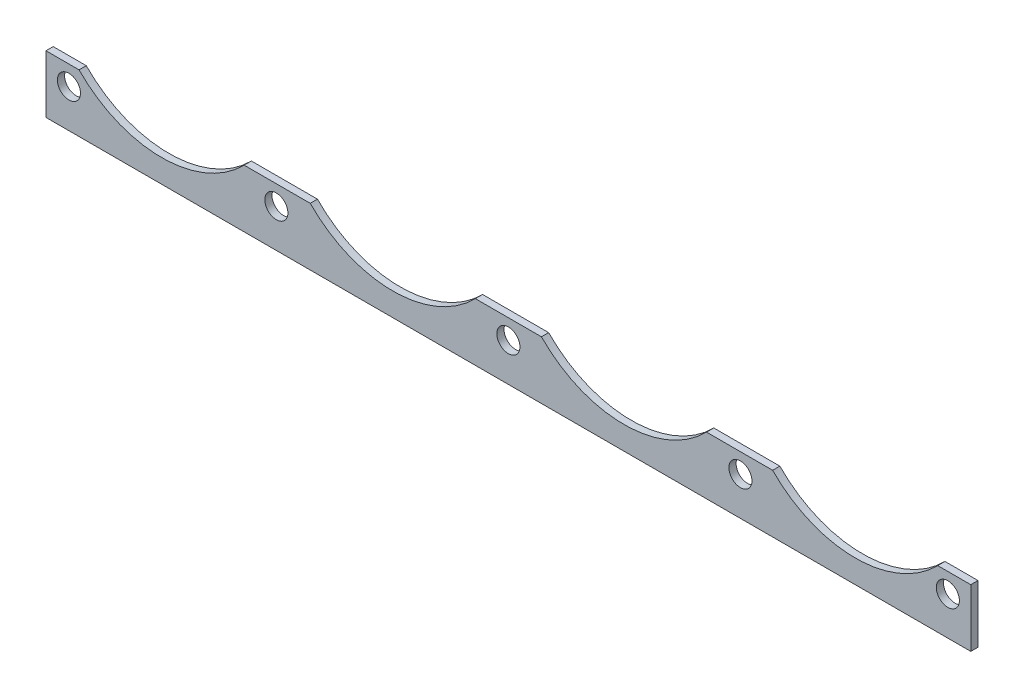
ISO-10303-21;
HEADER;
FILE_DESCRIPTION(('STEP AP214'),'2;1');
FILE_NAME('part.step','',(''),(''),'','','');
FILE_SCHEMA(('AUTOMOTIVE_DESIGN { 1 0 10303 214 1 1 1 1 }'));
ENDSEC;
DATA;
#1=APPLICATION_CONTEXT('core data for automotive mechanical design processes');
#2=APPLICATION_PROTOCOL_DEFINITION('international standard','automotive_design',2000,#1);
#3=PRODUCT_CONTEXT('',#1,'mechanical');
#4=PRODUCT('Part','Part','',(#3));
#5=PRODUCT_RELATED_PRODUCT_CATEGORY('part','',(#4));
#6=PRODUCT_DEFINITION_FORMATION('','',#4);
#7=PRODUCT_DEFINITION_CONTEXT('part definition',#1,'design');
#8=PRODUCT_DEFINITION('design','',#6,#7);
#9=PRODUCT_DEFINITION_SHAPE('','',#8);
#10=(LENGTH_UNIT() NAMED_UNIT(*) SI_UNIT(.MILLI.,.METRE.));
#11=(NAMED_UNIT(*) PLANE_ANGLE_UNIT() SI_UNIT($,.RADIAN.));
#12=(NAMED_UNIT(*) SI_UNIT($,.STERADIAN.) SOLID_ANGLE_UNIT());
#13=UNCERTAINTY_MEASURE_WITH_UNIT(LENGTH_MEASURE(1.E-05),#10,'distance_accuracy_value','');
#14=(GEOMETRIC_REPRESENTATION_CONTEXT(3) GLOBAL_UNCERTAINTY_ASSIGNED_CONTEXT((#13)) GLOBAL_UNIT_ASSIGNED_CONTEXT((#10,
#11,#12)) REPRESENTATION_CONTEXT('',''));
#15=CARTESIAN_POINT('',(0.,0.,0.));
#16=DIRECTION('',(0.,0.,1.));
#17=DIRECTION('',(1.,0.,0.));
#18=AXIS2_PLACEMENT_3D('',#15,#16,#17);
#19=CARTESIAN_POINT('',(25.4,30.48,0.79375));
#20=DIRECTION('',(0.,0.,-1.));
#21=DIRECTION('',(-1.,0.,0.));
#22=AXIS2_PLACEMENT_3D('',#19,#20,#21);
#23=CYLINDRICAL_SURFACE('',#22,25.4);
#24=CARTESIAN_POINT('',(25.4,30.48,-0.79375));
#25=DIRECTION('',(0.,0.,1.));
#26=DIRECTION('',(1.,0.,0.));
#27=AXIS2_PLACEMENT_3D('',#24,#25,#26);
#28=CIRCLE('',#27,25.4);
#29=CARTESIAN_POINT('',(7.26077179150114,12.7,-0.79375));
#30=VERTEX_POINT('',#29);
#31=CARTESIAN_POINT('',(43.5392282084988,12.7,-0.79375));
#32=VERTEX_POINT('',#31);
#33=EDGE_CURVE('E167',#30,#32,#28,.T.);
#34=ORIENTED_EDGE('',*,*,#33,.F.);
#35=DIRECTION('',(0.,0.,-1.));
#36=VECTOR('',#35,1.);
#37=CARTESIAN_POINT('',(7.26077179150114,12.7,0.79375));
#38=LINE('',#37,#36);
#39=CARTESIAN_POINT('',(7.26077179150114,12.7,0.79375));
#40=VERTEX_POINT('',#39);
#41=EDGE_CURVE('E11',#40,#30,#38,.T.);
#42=ORIENTED_EDGE('',*,*,#41,.F.);
#43=CARTESIAN_POINT('',(25.4,30.48,0.79375));
#44=DIRECTION('',(0.,0.,1.));
#45=DIRECTION('',(1.,0.,0.));
#46=AXIS2_PLACEMENT_3D('',#43,#44,#45);
#47=CIRCLE('',#46,25.4);
#48=CARTESIAN_POINT('',(43.5392282084988,12.7,0.79375));
#49=VERTEX_POINT('',#48);
#50=EDGE_CURVE('E262',#40,#49,#47,.T.);
#51=ORIENTED_EDGE('',*,*,#50,.T.);
#52=DIRECTION('',(0.,0.,-1.));
#53=VECTOR('',#52,1.);
#54=CARTESIAN_POINT('',(43.5392282084988,12.7,0.79375));
#55=LINE('',#54,#53);
#56=EDGE_CURVE('E52',#49,#32,#55,.T.);
#57=ORIENTED_EDGE('',*,*,#56,.T.);
#58=EDGE_LOOP('',(#34,#42,#51,#57));
#59=FACE_BOUND('',#58,.T.);
#60=ADVANCED_FACE('F35',(#59),#23,.F.);
#61=CARTESIAN_POINT('',(0.,12.7,0.79375));
#62=DIRECTION('',(0.,1.,0.));
#63=DIRECTION('',(-1.,0.,0.));
#64=AXIS2_PLACEMENT_3D('',#61,#62,#63);
#65=PLANE('',#64);
#66=DIRECTION('',(1.,0.,0.));
#67=VECTOR('',#66,1.);
#68=CARTESIAN_POINT('',(0.,12.7,-0.79375));
#69=LINE('',#68,#67);
#70=CARTESIAN_POINT('',(-7.26077179150115,12.7,-0.79375));
#71=VERTEX_POINT('',#70);
#72=EDGE_CURVE('E169',#71,#30,#69,.T.);
#73=ORIENTED_EDGE('',*,*,#72,.F.);
#74=DIRECTION('',(0.,0.,-1.));
#75=VECTOR('',#74,1.);
#76=CARTESIAN_POINT('',(-7.26077179150115,12.7,0.79375));
#77=LINE('',#76,#75);
#78=CARTESIAN_POINT('',(-7.26077179150115,12.7,0.79375));
#79=VERTEX_POINT('',#78);
#80=EDGE_CURVE('E44',#79,#71,#77,.T.);
#81=ORIENTED_EDGE('',*,*,#80,.F.);
#82=DIRECTION('',(1.,0.,0.));
#83=VECTOR('',#82,1.);
#84=CARTESIAN_POINT('',(0.,12.7,0.79375));
#85=LINE('',#84,#83);
#86=EDGE_CURVE('E258',#79,#40,#85,.T.);
#87=ORIENTED_EDGE('',*,*,#86,.T.);
#88=ORIENTED_EDGE('',*,*,#41,.T.);
#89=EDGE_LOOP('',(#73,#81,#87,#88));
#90=FACE_BOUND('',#89,.T.);
#91=ADVANCED_FACE('F232',(#90),#65,.T.);
#92=CARTESIAN_POINT('',(-25.4,30.48,0.79375));
#93=DIRECTION('',(0.,0.,-1.));
#94=DIRECTION('',(-1.,0.,0.));
#95=AXIS2_PLACEMENT_3D('',#92,#93,#94);
#96=CYLINDRICAL_SURFACE('',#95,25.4);
#97=CARTESIAN_POINT('',(-25.4,30.48,-0.79375));
#98=DIRECTION('',(0.,0.,1.));
#99=DIRECTION('',(1.,0.,0.));
#100=AXIS2_PLACEMENT_3D('',#97,#98,#99);
#101=CIRCLE('',#100,25.4);
#102=CARTESIAN_POINT('',(-43.5392282084988,12.7,-0.79375));
#103=VERTEX_POINT('',#102);
#104=EDGE_CURVE('E172',#103,#71,#101,.T.);
#105=ORIENTED_EDGE('',*,*,#104,.F.);
#106=DIRECTION('',(0.,0.,-1.));
#107=VECTOR('',#106,1.);
#108=CARTESIAN_POINT('',(-43.5392282084988,12.7,0.79375));
#109=LINE('',#108,#107);
#110=CARTESIAN_POINT('',(-43.5392282084988,12.7,0.79375));
#111=VERTEX_POINT('',#110);
#112=EDGE_CURVE('E220',#111,#103,#109,.T.);
#113=ORIENTED_EDGE('',*,*,#112,.F.);
#114=CARTESIAN_POINT('',(-25.4,30.48,0.79375));
#115=DIRECTION('',(0.,0.,1.));
#116=DIRECTION('',(1.,0.,0.));
#117=AXIS2_PLACEMENT_3D('',#114,#115,#116);
#118=CIRCLE('',#117,25.4);
#119=EDGE_CURVE('E228',#111,#79,#118,.T.);
#120=ORIENTED_EDGE('',*,*,#119,.T.);
#121=ORIENTED_EDGE('',*,*,#80,.T.);
#122=EDGE_LOOP('',(#105,#113,#120,#121));
#123=FACE_BOUND('',#122,.T.);
#124=ADVANCED_FACE('F225',(#123),#96,.F.);
#125=CARTESIAN_POINT('',(-58.0607717915011,12.7,-0.79375));
#126=VERTEX_POINT('',#125);
#127=EDGE_CURVE('E174',#126,#103,#69,.T.);
#128=ORIENTED_EDGE('',*,*,#127,.F.);
#129=DIRECTION('',(0.,0.,-1.));
#130=VECTOR('',#129,1.);
#131=CARTESIAN_POINT('',(-58.0607717915011,12.7,0.79375));
#132=LINE('',#131,#130);
#133=CARTESIAN_POINT('',(-58.0607717915011,12.7,0.79375));
#134=VERTEX_POINT('',#133);
#135=EDGE_CURVE('E218',#134,#126,#132,.T.);
#136=ORIENTED_EDGE('',*,*,#135,.F.);
#137=EDGE_CURVE('E256',#134,#111,#85,.T.);
#138=ORIENTED_EDGE('',*,*,#137,.T.);
#139=ORIENTED_EDGE('',*,*,#112,.T.);
#140=EDGE_LOOP('',(#128,#136,#138,#139));
#141=FACE_BOUND('',#140,.T.);
#142=ADVANCED_FACE('F255',(#141),#65,.T.);
#143=CARTESIAN_POINT('',(-76.2,30.48,0.79375));
#144=DIRECTION('',(0.,0.,-1.));
#145=DIRECTION('',(-1.,0.,0.));
#146=AXIS2_PLACEMENT_3D('',#143,#144,#145);
#147=CYLINDRICAL_SURFACE('',#146,25.4);
#148=CARTESIAN_POINT('',(-76.2,30.48,-0.79375));
#149=DIRECTION('',(0.,0.,1.));
#150=DIRECTION('',(1.,0.,0.));
#151=AXIS2_PLACEMENT_3D('',#148,#149,#150);
#152=CIRCLE('',#151,25.4);
#153=CARTESIAN_POINT('',(-94.3392282084988,12.7,-0.79375));
#154=VERTEX_POINT('',#153);
#155=EDGE_CURVE('E177',#154,#126,#152,.T.);
#156=ORIENTED_EDGE('',*,*,#155,.F.);
#157=DIRECTION('',(0.,0.,-1.));
#158=VECTOR('',#157,1.);
#159=CARTESIAN_POINT('',(-94.3392282084988,12.7,0.79375));
#160=LINE('',#159,#158);
#161=CARTESIAN_POINT('',(-94.3392282084988,12.7,0.79375));
#162=VERTEX_POINT('',#161);
#163=EDGE_CURVE('E216',#162,#154,#160,.T.);
#164=ORIENTED_EDGE('',*,*,#163,.F.);
#165=CARTESIAN_POINT('',(-76.2,30.48,0.79375));
#166=DIRECTION('',(0.,0.,1.));
#167=DIRECTION('',(1.,0.,0.));
#168=AXIS2_PLACEMENT_3D('',#165,#166,#167);
#169=CIRCLE('',#168,25.4);
#170=EDGE_CURVE('E252',#162,#134,#169,.T.);
#171=ORIENTED_EDGE('',*,*,#170,.T.);
#172=ORIENTED_EDGE('',*,*,#135,.T.);
#173=EDGE_LOOP('',(#156,#164,#171,#172));
#174=FACE_BOUND('',#173,.T.);
#175=ADVANCED_FACE('F251',(#174),#147,.F.);
#176=CARTESIAN_POINT('',(-101.6,12.7,-0.79375));
#177=VERTEX_POINT('',#176);
#178=EDGE_CURVE('E173',#177,#154,#69,.T.);
#179=ORIENTED_EDGE('',*,*,#178,.F.);
#180=DIRECTION('',(0.,0.,-1.));
#181=VECTOR('',#180,1.);
#182=CARTESIAN_POINT('',(-101.6,12.7,0.79375));
#183=LINE('',#182,#181);
#184=CARTESIAN_POINT('',(-101.6,12.7,0.79375));
#185=VERTEX_POINT('',#184);
#186=EDGE_CURVE('E214',#185,#177,#183,.T.);
#187=ORIENTED_EDGE('',*,*,#186,.F.);
#188=EDGE_CURVE('E247',#185,#162,#85,.T.);
#189=ORIENTED_EDGE('',*,*,#188,.T.);
#190=ORIENTED_EDGE('',*,*,#163,.T.);
#191=EDGE_LOOP('',(#179,#187,#189,#190));
#192=FACE_BOUND('',#191,.T.);
#193=ADVANCED_FACE('F243',(#192),#65,.T.);
#194=CARTESIAN_POINT('',(-101.6,1.11022302462516E-13,0.79375));
#195=DIRECTION('',(1.,0.,0.));
#196=DIRECTION('',(0.,1.,0.));
#197=AXIS2_PLACEMENT_3D('',#194,#195,#196);
#198=PLANE('',#197);
#199=DIRECTION('',(0.,-1.,0.));
#200=VECTOR('',#199,1.);
#201=CARTESIAN_POINT('',(-101.6,1.11022302462516E-13,-0.79375));
#202=LINE('',#201,#200);
#203=CARTESIAN_POINT('',(-101.6,0.,-0.79375));
#204=VERTEX_POINT('',#203);
#205=EDGE_CURVE('E180',#177,#204,#202,.T.);
#206=ORIENTED_EDGE('',*,*,#205,.T.);
#207=DIRECTION('',(0.,0.,-1.));
#208=VECTOR('',#207,1.);
#209=CARTESIAN_POINT('',(-101.6,0.,0.79375));
#210=LINE('',#209,#208);
#211=CARTESIAN_POINT('',(-101.6,0.,0.79375));
#212=VERTEX_POINT('',#211);
#213=EDGE_CURVE('E211',#212,#204,#210,.T.);
#214=ORIENTED_EDGE('',*,*,#213,.F.);
#215=DIRECTION('',(0.,-1.,0.));
#216=VECTOR('',#215,1.);
#217=CARTESIAN_POINT('',(-101.6,1.11022302462516E-13,0.79375));
#218=LINE('',#217,#216);
#219=EDGE_CURVE('E263',#185,#212,#218,.T.);
#220=ORIENTED_EDGE('',*,*,#219,.F.);
#221=ORIENTED_EDGE('',*,*,#186,.T.);
#222=EDGE_LOOP('',(#206,#214,#220,#221));
#223=FACE_BOUND('',#222,.T.);
#224=ADVANCED_FACE('F300',(#223),#198,.F.);
#225=CARTESIAN_POINT('',(0.,0.,0.79375));
#226=DIRECTION('',(0.,1.,0.));
#227=DIRECTION('',(0.,0.,1.));
#228=AXIS2_PLACEMENT_3D('',#225,#226,#227);
#229=PLANE('',#228);
#230=DIRECTION('',(1.,0.,0.));
#231=VECTOR('',#230,1.);
#232=CARTESIAN_POINT('',(0.,0.,-0.79375));
#233=LINE('',#232,#231);
#234=CARTESIAN_POINT('',(101.6,0.,-0.79375));
#235=VERTEX_POINT('',#234);
#236=EDGE_CURVE('E183',#204,#235,#233,.T.);
#237=ORIENTED_EDGE('',*,*,#236,.T.);
#238=DIRECTION('',(0.,0.,-1.));
#239=VECTOR('',#238,1.);
#240=CARTESIAN_POINT('',(101.6,0.,0.79375));
#241=LINE('',#240,#239);
#242=CARTESIAN_POINT('',(101.6,0.,0.79375));
#243=VERTEX_POINT('',#242);
#244=EDGE_CURVE('E209',#243,#235,#241,.T.);
#245=ORIENTED_EDGE('',*,*,#244,.F.);
#246=DIRECTION('',(1.,0.,0.));
#247=VECTOR('',#246,1.);
#248=CARTESIAN_POINT('',(0.,0.,0.79375));
#249=LINE('',#248,#247);
#250=EDGE_CURVE('E265',#212,#243,#249,.T.);
#251=ORIENTED_EDGE('',*,*,#250,.F.);
#252=ORIENTED_EDGE('',*,*,#213,.T.);
#253=EDGE_LOOP('',(#237,#245,#251,#252));
#254=FACE_BOUND('',#253,.T.);
#255=ADVANCED_FACE('F303',(#254),#229,.F.);
#256=CARTESIAN_POINT('',(101.6,1.11022302462515E-13,0.79375));
#257=DIRECTION('',(1.,0.,0.));
#258=DIRECTION('',(0.,1.,0.));
#259=AXIS2_PLACEMENT_3D('',#256,#257,#258);
#260=PLANE('',#259);
#261=DIRECTION('',(0.,-1.,0.));
#262=VECTOR('',#261,1.);
#263=CARTESIAN_POINT('',(101.6,1.11022302462515E-13,-0.79375));
#264=LINE('',#263,#262);
#265=CARTESIAN_POINT('',(101.6,12.7,-0.79375));
#266=VERTEX_POINT('',#265);
#267=EDGE_CURVE('E186',#266,#235,#264,.T.);
#268=ORIENTED_EDGE('',*,*,#267,.F.);
#269=DIRECTION('',(0.,0.,-1.));
#270=VECTOR('',#269,1.);
#271=CARTESIAN_POINT('',(101.6,12.7,0.79375));
#272=LINE('',#271,#270);
#273=CARTESIAN_POINT('',(101.6,12.7,0.79375));
#274=VERTEX_POINT('',#273);
#275=EDGE_CURVE('E135',#274,#266,#272,.T.);
#276=ORIENTED_EDGE('',*,*,#275,.F.);
#277=DIRECTION('',(0.,-1.,0.));
#278=VECTOR('',#277,1.);
#279=CARTESIAN_POINT('',(101.6,1.11022302462515E-13,0.79375));
#280=LINE('',#279,#278);
#281=EDGE_CURVE('E145',#274,#243,#280,.T.);
#282=ORIENTED_EDGE('',*,*,#281,.T.);
#283=ORIENTED_EDGE('',*,*,#244,.T.);
#284=EDGE_LOOP('',(#268,#276,#282,#283));
#285=FACE_BOUND('',#284,.T.);
#286=ADVANCED_FACE('F271',(#285),#260,.T.);
#287=CARTESIAN_POINT('',(0.,12.7,0.79375));
#288=DIRECTION('',(0.,1.,0.));
#289=DIRECTION('',(-1.,0.,0.));
#290=AXIS2_PLACEMENT_3D('',#287,#288,#289);
#291=PLANE('',#290);
#292=DIRECTION('',(1.,0.,0.));
#293=VECTOR('',#292,1.);
#294=CARTESIAN_POINT('',(0.,12.7,-0.79375));
#295=LINE('',#294,#293);
#296=CARTESIAN_POINT('',(94.3392282084989,12.7,-0.79375));
#297=VERTEX_POINT('',#296);
#298=EDGE_CURVE('E131',#297,#266,#295,.T.);
#299=ORIENTED_EDGE('',*,*,#298,.F.);
#300=DIRECTION('',(0.,0.,-1.));
#301=VECTOR('',#300,1.);
#302=CARTESIAN_POINT('',(94.3392282084989,12.7,0.79375));
#303=LINE('',#302,#301);
#304=CARTESIAN_POINT('',(94.3392282084989,12.7,0.79375));
#305=VERTEX_POINT('',#304);
#306=EDGE_CURVE('E126',#305,#297,#303,.T.);
#307=ORIENTED_EDGE('',*,*,#306,.F.);
#308=DIRECTION('',(1.,0.,0.));
#309=VECTOR('',#308,1.);
#310=CARTESIAN_POINT('',(0.,12.7,0.79375));
#311=LINE('',#310,#309);
#312=EDGE_CURVE('E129',#305,#274,#311,.T.);
#313=ORIENTED_EDGE('',*,*,#312,.T.);
#314=ORIENTED_EDGE('',*,*,#275,.T.);
#315=EDGE_LOOP('',(#299,#307,#313,#314));
#316=FACE_BOUND('',#315,.T.);
#317=ADVANCED_FACE('F128',(#316),#291,.T.);
#318=CARTESIAN_POINT('',(76.2,30.48,0.79375));
#319=DIRECTION('',(0.,0.,-1.));
#320=DIRECTION('',(-1.,0.,0.));
#321=AXIS2_PLACEMENT_3D('',#318,#319,#320);
#322=CYLINDRICAL_SURFACE('',#321,25.4);
#323=CARTESIAN_POINT('',(76.2,30.48,-0.79375));
#324=DIRECTION('',(0.,0.,1.));
#325=DIRECTION('',(1.,0.,0.));
#326=AXIS2_PLACEMENT_3D('',#323,#324,#325);
#327=CIRCLE('',#326,25.4);
#328=CARTESIAN_POINT('',(58.0607717915011,12.7,-0.79375));
#329=VERTEX_POINT('',#328);
#330=EDGE_CURVE('E190',#329,#297,#327,.T.);
#331=ORIENTED_EDGE('',*,*,#330,.F.);
#332=DIRECTION('',(0.,0.,-1.));
#333=VECTOR('',#332,1.);
#334=CARTESIAN_POINT('',(58.0607717915011,12.7,0.79375));
#335=LINE('',#334,#333);
#336=CARTESIAN_POINT('',(58.0607717915011,12.7,0.79375));
#337=VERTEX_POINT('',#336);
#338=EDGE_CURVE('E89',#337,#329,#335,.T.);
#339=ORIENTED_EDGE('',*,*,#338,.F.);
#340=CARTESIAN_POINT('',(76.2,30.48,0.79375));
#341=DIRECTION('',(0.,0.,1.));
#342=DIRECTION('',(1.,0.,0.));
#343=AXIS2_PLACEMENT_3D('',#340,#341,#342);
#344=CIRCLE('',#343,25.4);
#345=EDGE_CURVE('E143',#337,#305,#344,.T.);
#346=ORIENTED_EDGE('',*,*,#345,.T.);
#347=ORIENTED_EDGE('',*,*,#306,.T.);
#348=EDGE_LOOP('',(#331,#339,#346,#347));
#349=FACE_BOUND('',#348,.T.);
#350=ADVANCED_FACE('F148',(#349),#322,.F.);
#351=CARTESIAN_POINT('',(96.5620428456801,8.39889607557412,0.79375));
#352=DIRECTION('',(0.,0.,-1.));
#353=DIRECTION('',(-1.,0.,0.));
#354=AXIS2_PLACEMENT_3D('',#351,#352,#353);
#355=CYLINDRICAL_SURFACE('',#354,2.54);
#356=CARTESIAN_POINT('',(96.5620428456801,8.39889607557412,0.79375));
#357=DIRECTION('',(0.,0.,1.));
#358=DIRECTION('',(1.,0.,0.));
#359=AXIS2_PLACEMENT_3D('',#356,#357,#358);
#360=CIRCLE('',#359,2.54);
#361=CARTESIAN_POINT('',(99.1020428456801,8.39889607557412,0.79375));
#362=VERTEX_POINT('',#361);
#363=EDGE_CURVE('E158',#362,#362,#360,.F.);
#364=ORIENTED_EDGE('',*,*,#363,.F.);
#365=EDGE_LOOP('',(#364));
#366=FACE_BOUND('',#365,.T.);
#367=CARTESIAN_POINT('',(96.5620428456801,8.39889607557412,-0.79375));
#368=DIRECTION('',(0.,0.,1.));
#369=DIRECTION('',(1.,0.,0.));
#370=AXIS2_PLACEMENT_3D('',#367,#368,#369);
#371=CIRCLE('',#370,2.54);
#372=CARTESIAN_POINT('',(99.1020428456801,8.39889607557412,-0.79375));
#373=VERTEX_POINT('',#372);
#374=EDGE_CURVE('E199',#373,#373,#371,.F.);
#375=ORIENTED_EDGE('',*,*,#374,.T.);
#376=EDGE_LOOP('',(#375));
#377=FACE_BOUND('',#376,.T.);
#378=ADVANCED_FACE('F310',(#366,#377),#355,.F.);
#379=CARTESIAN_POINT('',(-50.9847330059411,8.39889607557412,0.79375));
#380=DIRECTION('',(0.,0.,-1.));
#381=DIRECTION('',(-1.,0.,0.));
#382=AXIS2_PLACEMENT_3D('',#379,#380,#381);
#383=CYLINDRICAL_SURFACE('',#382,2.54);
#384=CARTESIAN_POINT('',(-50.9847330059411,8.39889607557412,0.79375));
#385=DIRECTION('',(0.,0.,1.));
#386=DIRECTION('',(1.,0.,0.));
#387=AXIS2_PLACEMENT_3D('',#384,#385,#386);
#388=CIRCLE('',#387,2.54);
#389=CARTESIAN_POINT('',(-48.4447330059411,8.39889607557412,0.79375));
#390=VERTEX_POINT('',#389);
#391=EDGE_CURVE('E155',#390,#390,#388,.T.);
#392=ORIENTED_EDGE('',*,*,#391,.T.);
#393=EDGE_LOOP('',(#392));
#394=FACE_BOUND('',#393,.T.);
#395=CARTESIAN_POINT('',(-50.9847330059411,8.39889607557412,-0.79375));
#396=DIRECTION('',(0.,0.,1.));
#397=DIRECTION('',(1.,0.,0.));
#398=AXIS2_PLACEMENT_3D('',#395,#396,#397);
#399=CIRCLE('',#398,2.54);
#400=CARTESIAN_POINT('',(-48.4447330059411,8.39889607557412,-0.79375));
#401=VERTEX_POINT('',#400);
#402=EDGE_CURVE('E196',#401,#401,#399,.T.);
#403=ORIENTED_EDGE('',*,*,#402,.F.);
#404=EDGE_LOOP('',(#403));
#405=FACE_BOUND('',#404,.T.);
#406=ADVANCED_FACE('F284',(#394,#405),#383,.F.);
#407=CARTESIAN_POINT('',(-96.5620428456801,8.39889607557412,0.79375));
#408=DIRECTION('',(0.,0.,-1.));
#409=DIRECTION('',(-1.,0.,0.));
#410=AXIS2_PLACEMENT_3D('',#407,#408,#409);
#411=CYLINDRICAL_SURFACE('',#410,2.54);
#412=CARTESIAN_POINT('',(-96.5620428456801,8.39889607557412,0.79375));
#413=DIRECTION('',(0.,0.,1.));
#414=DIRECTION('',(1.,0.,0.));
#415=AXIS2_PLACEMENT_3D('',#412,#413,#414);
#416=CIRCLE('',#415,2.54);
#417=CARTESIAN_POINT('',(-94.0220428456801,8.39889607557412,0.79375));
#418=VERTEX_POINT('',#417);
#419=EDGE_CURVE('E150',#418,#418,#416,.T.);
#420=ORIENTED_EDGE('',*,*,#419,.T.);
#421=EDGE_LOOP('',(#420));
#422=FACE_BOUND('',#421,.T.);
#423=CARTESIAN_POINT('',(-96.5620428456801,8.39889607557412,-0.79375));
#424=DIRECTION('',(0.,0.,1.));
#425=DIRECTION('',(1.,0.,0.));
#426=AXIS2_PLACEMENT_3D('',#423,#424,#425);
#427=CIRCLE('',#426,2.54);
#428=CARTESIAN_POINT('',(-94.0220428456801,8.39889607557412,-0.79375));
#429=VERTEX_POINT('',#428);
#430=EDGE_CURVE('E193',#429,#429,#427,.T.);
#431=ORIENTED_EDGE('',*,*,#430,.F.);
#432=EDGE_LOOP('',(#431));
#433=FACE_BOUND('',#432,.T.);
#434=ADVANCED_FACE('F276',(#422,#433),#411,.F.);
#435=EDGE_CURVE('E191',#32,#329,#295,.T.);
#436=ORIENTED_EDGE('',*,*,#435,.F.);
#437=ORIENTED_EDGE('',*,*,#56,.F.);
#438=EDGE_CURVE('E147',#49,#337,#311,.T.);
#439=ORIENTED_EDGE('',*,*,#438,.T.);
#440=ORIENTED_EDGE('',*,*,#338,.T.);
#441=EDGE_LOOP('',(#436,#437,#439,#440));
#442=FACE_BOUND('',#441,.T.);
#443=ADVANCED_FACE('F274',(#442),#291,.T.);
#444=CARTESIAN_POINT('',(0.,8.39889607557412,0.79375));
#445=DIRECTION('',(0.,0.,-1.));
#446=DIRECTION('',(-1.,0.,0.));
#447=AXIS2_PLACEMENT_3D('',#444,#445,#446);
#448=CYLINDRICAL_SURFACE('',#447,2.54);
#449=CARTESIAN_POINT('',(0.,8.39889607557412,0.79375));
#450=DIRECTION('',(0.,0.,1.));
#451=DIRECTION('',(1.,0.,0.));
#452=AXIS2_PLACEMENT_3D('',#449,#450,#451);
#453=CIRCLE('',#452,2.54);
#454=CARTESIAN_POINT('',(2.54,8.39889607557412,0.79375));
#455=VERTEX_POINT('',#454);
#456=EDGE_CURVE('E205',#455,#455,#453,.T.);
#457=ORIENTED_EDGE('',*,*,#456,.T.);
#458=EDGE_LOOP('',(#457));
#459=FACE_BOUND('',#458,.T.);
#460=CARTESIAN_POINT('',(0.,8.39889607557412,-0.79375));
#461=DIRECTION('',(0.,0.,1.));
#462=DIRECTION('',(1.,0.,0.));
#463=AXIS2_PLACEMENT_3D('',#460,#461,#462);
#464=CIRCLE('',#463,2.54);
#465=CARTESIAN_POINT('',(2.54,8.39889607557412,-0.79375));
#466=VERTEX_POINT('',#465);
#467=EDGE_CURVE('E164',#466,#466,#464,.T.);
#468=ORIENTED_EDGE('',*,*,#467,.F.);
#469=EDGE_LOOP('',(#468));
#470=FACE_BOUND('',#469,.T.);
#471=ADVANCED_FACE('F37',(#459,#470),#448,.F.);
#472=CARTESIAN_POINT('',(50.9847330059411,8.39889607557412,0.79375));
#473=DIRECTION('',(0.,0.,-1.));
#474=DIRECTION('',(-1.,0.,0.));
#475=AXIS2_PLACEMENT_3D('',#472,#473,#474);
#476=CYLINDRICAL_SURFACE('',#475,2.54);
#477=CARTESIAN_POINT('',(50.9847330059411,8.39889607557412,0.79375));
#478=DIRECTION('',(0.,0.,1.));
#479=DIRECTION('',(1.,0.,0.));
#480=AXIS2_PLACEMENT_3D('',#477,#478,#479);
#481=CIRCLE('',#480,2.54);
#482=CARTESIAN_POINT('',(53.5247330059411,8.39889607557412,0.79375));
#483=VERTEX_POINT('',#482);
#484=EDGE_CURVE('E161',#483,#483,#481,.T.);
#485=ORIENTED_EDGE('',*,*,#484,.T.);
#486=EDGE_LOOP('',(#485));
#487=FACE_BOUND('',#486,.T.);
#488=CARTESIAN_POINT('',(50.9847330059411,8.39889607557412,-0.79375));
#489=DIRECTION('',(0.,0.,1.));
#490=DIRECTION('',(1.,0.,0.));
#491=AXIS2_PLACEMENT_3D('',#488,#489,#490);
#492=CIRCLE('',#491,2.54);
#493=CARTESIAN_POINT('',(53.5247330059411,8.39889607557412,-0.79375));
#494=VERTEX_POINT('',#493);
#495=EDGE_CURVE('E202',#494,#494,#492,.T.);
#496=ORIENTED_EDGE('',*,*,#495,.F.);
#497=EDGE_LOOP('',(#496));
#498=FACE_BOUND('',#497,.T.);
#499=ADVANCED_FACE('F282',(#487,#498),#476,.F.);
#500=CARTESIAN_POINT('',(0.,0.,0.79375));
#501=DIRECTION('',(0.,0.,1.));
#502=DIRECTION('',(1.,0.,0.));
#503=AXIS2_PLACEMENT_3D('',#500,#501,#502);
#504=PLANE('',#503);
#505=ORIENTED_EDGE('',*,*,#456,.F.);
#506=EDGE_LOOP('',(#505));
#507=FACE_BOUND('',#506,.T.);
#508=ORIENTED_EDGE('',*,*,#50,.F.);
#509=ORIENTED_EDGE('',*,*,#86,.F.);
#510=ORIENTED_EDGE('',*,*,#119,.F.);
#511=ORIENTED_EDGE('',*,*,#137,.F.);
#512=ORIENTED_EDGE('',*,*,#170,.F.);
#513=ORIENTED_EDGE('',*,*,#188,.F.);
#514=ORIENTED_EDGE('',*,*,#219,.T.);
#515=ORIENTED_EDGE('',*,*,#250,.T.);
#516=ORIENTED_EDGE('',*,*,#281,.F.);
#517=ORIENTED_EDGE('',*,*,#312,.F.);
#518=ORIENTED_EDGE('',*,*,#345,.F.);
#519=ORIENTED_EDGE('',*,*,#438,.F.);
#520=EDGE_LOOP('',(#508,#509,#510,#511,#512,#513,#514,#515,#516,#517,#518,#519));
#521=FACE_BOUND('',#520,.T.);
#522=ORIENTED_EDGE('',*,*,#419,.F.);
#523=EDGE_LOOP('',(#522));
#524=FACE_BOUND('',#523,.T.);
#525=ORIENTED_EDGE('',*,*,#391,.F.);
#526=EDGE_LOOP('',(#525));
#527=FACE_BOUND('',#526,.T.);
#528=ORIENTED_EDGE('',*,*,#363,.T.);
#529=EDGE_LOOP('',(#528));
#530=FACE_BOUND('',#529,.T.);
#531=ORIENTED_EDGE('',*,*,#484,.F.);
#532=EDGE_LOOP('',(#531));
#533=FACE_BOUND('',#532,.T.);
#534=ADVANCED_FACE('F140',(#507,#521,#524,#527,#530,#533),#504,.T.);
#535=CARTESIAN_POINT('',(0.,0.,-0.79375));
#536=DIRECTION('',(0.,0.,1.));
#537=DIRECTION('',(1.,0.,0.));
#538=AXIS2_PLACEMENT_3D('',#535,#536,#537);
#539=PLANE('',#538);
#540=ORIENTED_EDGE('',*,*,#467,.T.);
#541=EDGE_LOOP('',(#540));
#542=FACE_BOUND('',#541,.T.);
#543=ORIENTED_EDGE('',*,*,#33,.T.);
#544=ORIENTED_EDGE('',*,*,#435,.T.);
#545=ORIENTED_EDGE('',*,*,#330,.T.);
#546=ORIENTED_EDGE('',*,*,#298,.T.);
#547=ORIENTED_EDGE('',*,*,#267,.T.);
#548=ORIENTED_EDGE('',*,*,#236,.F.);
#549=ORIENTED_EDGE('',*,*,#205,.F.);
#550=ORIENTED_EDGE('',*,*,#178,.T.);
#551=ORIENTED_EDGE('',*,*,#155,.T.);
#552=ORIENTED_EDGE('',*,*,#127,.T.);
#553=ORIENTED_EDGE('',*,*,#104,.T.);
#554=ORIENTED_EDGE('',*,*,#72,.T.);
#555=EDGE_LOOP('',(#543,#544,#545,#546,#547,#548,#549,#550,#551,#552,#553,#554));
#556=FACE_BOUND('',#555,.T.);
#557=ORIENTED_EDGE('',*,*,#430,.T.);
#558=EDGE_LOOP('',(#557));
#559=FACE_BOUND('',#558,.T.);
#560=ORIENTED_EDGE('',*,*,#402,.T.);
#561=EDGE_LOOP('',(#560));
#562=FACE_BOUND('',#561,.T.);
#563=ORIENTED_EDGE('',*,*,#374,.F.);
#564=EDGE_LOOP('',(#563));
#565=FACE_BOUND('',#564,.T.);
#566=ORIENTED_EDGE('',*,*,#495,.T.);
#567=EDGE_LOOP('',(#566));
#568=FACE_BOUND('',#567,.T.);
#569=ADVANCED_FACE('F234',(#542,#556,#559,#562,#565,#568),#539,.F.);
#570=CLOSED_SHELL('',(#60,#91,#124,#142,#175,#193,#224,#255,#286,#317,#350,#378,#406,#434,#443,
#471,#499,#534,#569));
#571=MANIFOLD_SOLID_BREP('B2',#570);
#572=ADVANCED_BREP_SHAPE_REPRESENTATION('',(#18,#571),#14);
#573=SHAPE_DEFINITION_REPRESENTATION(#9,#572);
ENDSEC;
END-ISO-10303-21;
